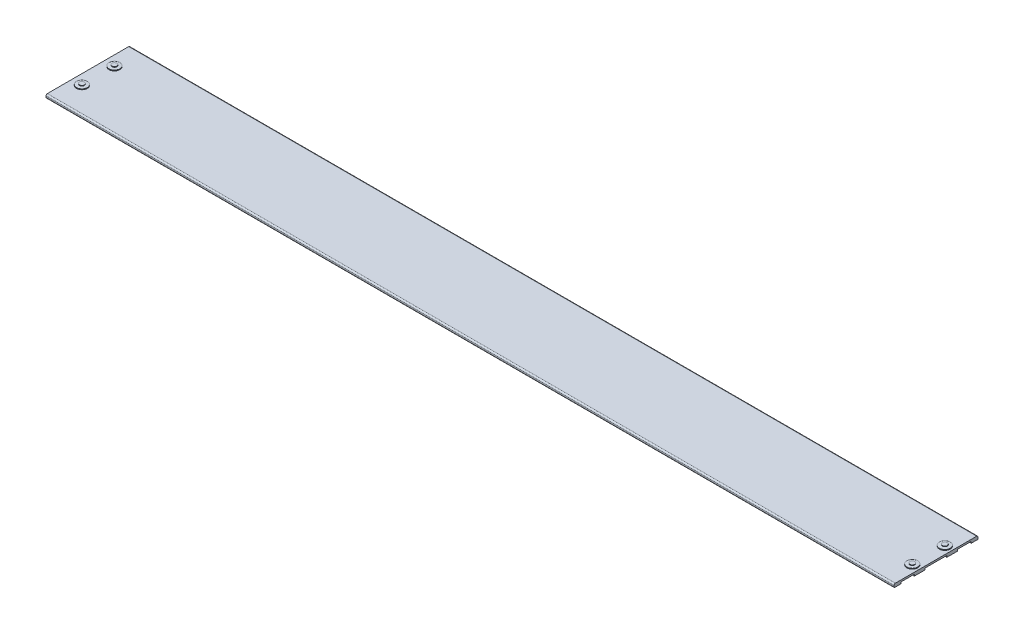
ISO-10303-21;
HEADER;
FILE_DESCRIPTION(('STEP AP214'),'2;1');
FILE_NAME('part.step','',(''),(''),'','','');
FILE_SCHEMA(('AUTOMOTIVE_DESIGN { 1 0 10303 214 1 1 1 1 }'));
ENDSEC;
DATA;
#1=APPLICATION_CONTEXT('core data for automotive mechanical design processes');
#2=APPLICATION_PROTOCOL_DEFINITION('international standard','automotive_design',2000,#1);
#3=PRODUCT_CONTEXT('',#1,'mechanical');
#4=PRODUCT('Part','Part','',(#3));
#5=PRODUCT_RELATED_PRODUCT_CATEGORY('part','',(#4));
#6=PRODUCT_DEFINITION_FORMATION('','',#4);
#7=PRODUCT_DEFINITION_CONTEXT('part definition',#1,'design');
#8=PRODUCT_DEFINITION('design','',#6,#7);
#9=PRODUCT_DEFINITION_SHAPE('','',#8);
#10=(LENGTH_UNIT() NAMED_UNIT(*) SI_UNIT(.MILLI.,.METRE.));
#11=(NAMED_UNIT(*) PLANE_ANGLE_UNIT() SI_UNIT($,.RADIAN.));
#12=(NAMED_UNIT(*) SI_UNIT($,.STERADIAN.) SOLID_ANGLE_UNIT());
#13=UNCERTAINTY_MEASURE_WITH_UNIT(LENGTH_MEASURE(1.E-05),#10,'distance_accuracy_value','');
#14=(GEOMETRIC_REPRESENTATION_CONTEXT(3) GLOBAL_UNCERTAINTY_ASSIGNED_CONTEXT((#13)) GLOBAL_UNIT_ASSIGNED_CONTEXT((#10,
#11,#12)) REPRESENTATION_CONTEXT('',''));
#15=CARTESIAN_POINT('',(0.,0.,0.));
#16=DIRECTION('',(0.,0.,1.));
#17=DIRECTION('',(1.,0.,0.));
#18=AXIS2_PLACEMENT_3D('',#15,#16,#17);
#19=CARTESIAN_POINT('',(-7.5,25.2,-11.1));
#20=DIRECTION('',(0.,1.,0.));
#21=DIRECTION('',(0.,0.,1.));
#22=AXIS2_PLACEMENT_3D('',#19,#20,#21);
#23=PLANE('',#22);
#24=CARTESIAN_POINT('',(-7.5,25.2,-12.));
#25=DIRECTION('',(0.,1.,0.));
#26=DIRECTION('',(0.,0.,1.));
#27=AXIS2_PLACEMENT_3D('',#24,#25,#26);
#28=CIRCLE('',#27,1.8);
#29=CARTESIAN_POINT('',(-7.5,25.2,-10.2));
#30=VERTEX_POINT('',#29);
#31=EDGE_CURVE('E19',#30,#30,#28,.F.);
#32=ORIENTED_EDGE('',*,*,#31,.F.);
#33=EDGE_LOOP('',(#32));
#34=FACE_BOUND('',#33,.T.);
#35=ADVANCED_FACE('F16',(#34),#23,.T.);
#36=CARTESIAN_POINT('',(605.5,25.2,-11.1));
#37=DIRECTION('',(0.,1.,0.));
#38=DIRECTION('',(0.,0.,1.));
#39=AXIS2_PLACEMENT_3D('',#36,#37,#38);
#40=PLANE('',#39);
#41=CARTESIAN_POINT('',(605.5,25.2,-12.));
#42=DIRECTION('',(0.,1.,0.));
#43=DIRECTION('',(0.,0.,1.));
#44=AXIS2_PLACEMENT_3D('',#41,#42,#43);
#45=CIRCLE('',#44,1.8);
#46=CARTESIAN_POINT('',(605.5,25.2,-10.2));
#47=VERTEX_POINT('',#46);
#48=EDGE_CURVE('E376',#47,#47,#45,.F.);
#49=ORIENTED_EDGE('',*,*,#48,.F.);
#50=EDGE_LOOP('',(#49));
#51=FACE_BOUND('',#50,.T.);
#52=ADVANCED_FACE('F386',(#51),#40,.T.);
#53=CARTESIAN_POINT('',(605.5,25.2,12.9));
#54=DIRECTION('',(0.,1.,0.));
#55=DIRECTION('',(0.,0.,1.));
#56=AXIS2_PLACEMENT_3D('',#53,#54,#55);
#57=PLANE('',#56);
#58=CARTESIAN_POINT('',(605.5,25.2,12.));
#59=DIRECTION('',(0.,1.,0.));
#60=DIRECTION('',(0.,0.,1.));
#61=AXIS2_PLACEMENT_3D('',#58,#59,#60);
#62=CIRCLE('',#61,1.8);
#63=CARTESIAN_POINT('',(605.5,25.2,13.8));
#64=VERTEX_POINT('',#63);
#65=EDGE_CURVE('E374',#64,#64,#62,.F.);
#66=ORIENTED_EDGE('',*,*,#65,.F.);
#67=EDGE_LOOP('',(#66));
#68=FACE_BOUND('',#67,.T.);
#69=ADVANCED_FACE('F391',(#68),#57,.T.);
#70=CARTESIAN_POINT('',(-7.5,25.2,12.9));
#71=DIRECTION('',(0.,1.,0.));
#72=DIRECTION('',(0.,0.,1.));
#73=AXIS2_PLACEMENT_3D('',#70,#71,#72);
#74=PLANE('',#73);
#75=CARTESIAN_POINT('',(-7.5,25.2,12.));
#76=DIRECTION('',(0.,1.,0.));
#77=DIRECTION('',(0.,0.,1.));
#78=AXIS2_PLACEMENT_3D('',#75,#76,#77);
#79=CIRCLE('',#78,1.8);
#80=CARTESIAN_POINT('',(-7.5,25.2,13.8));
#81=VERTEX_POINT('',#80);
#82=EDGE_CURVE('E302',#81,#81,#79,.F.);
#83=ORIENTED_EDGE('',*,*,#82,.F.);
#84=EDGE_LOOP('',(#83));
#85=FACE_BOUND('',#84,.T.);
#86=ADVANCED_FACE('F521',(#85),#74,.T.);
#87=CARTESIAN_POINT('',(-7.5,25.,-12.));
#88=DIRECTION('',(0.,1.,0.));
#89=DIRECTION('',(0.,0.,1.));
#90=AXIS2_PLACEMENT_3D('',#87,#88,#89);
#91=CYLINDRICAL_SURFACE('',#90,1.8);
#92=CARTESIAN_POINT('',(-7.5,24.8000000000062,-12.));
#93=DIRECTION('',(0.,-1.,0.));
#94=DIRECTION('',(0.,0.,1.));
#95=AXIS2_PLACEMENT_3D('',#92,#93,#94);
#96=CIRCLE('',#95,1.80000000000246);
#97=CARTESIAN_POINT('',(-7.5,24.8000000000062,-10.1999999999975));
#98=VERTEX_POINT('',#97);
#99=EDGE_CURVE('E313',#98,#98,#96,.T.);
#100=ORIENTED_EDGE('',*,*,#99,.F.);
#101=EDGE_LOOP('',(#100));
#102=FACE_BOUND('',#101,.T.);
#103=ORIENTED_EDGE('',*,*,#31,.T.);
#104=EDGE_LOOP('',(#103));
#105=FACE_BOUND('',#104,.T.);
#106=ADVANCED_FACE('F383',(#102,#105),#91,.T.);
#107=CARTESIAN_POINT('',(605.5,25.,-12.));
#108=DIRECTION('',(0.,1.,0.));
#109=DIRECTION('',(0.,0.,1.));
#110=AXIS2_PLACEMENT_3D('',#107,#108,#109);
#111=CYLINDRICAL_SURFACE('',#110,1.8);
#112=CARTESIAN_POINT('',(605.5,24.8000000000062,-12.));
#113=DIRECTION('',(0.,-1.,0.));
#114=DIRECTION('',(0.,0.,1.));
#115=AXIS2_PLACEMENT_3D('',#112,#113,#114);
#116=CIRCLE('',#115,1.80000000000246);
#117=CARTESIAN_POINT('',(605.5,24.8000000000062,-10.1999999999975));
#118=VERTEX_POINT('',#117);
#119=EDGE_CURVE('E310',#118,#118,#116,.T.);
#120=ORIENTED_EDGE('',*,*,#119,.F.);
#121=EDGE_LOOP('',(#120));
#122=FACE_BOUND('',#121,.T.);
#123=ORIENTED_EDGE('',*,*,#48,.T.);
#124=EDGE_LOOP('',(#123));
#125=FACE_BOUND('',#124,.T.);
#126=ADVANCED_FACE('F514',(#122,#125),#111,.T.);
#127=CARTESIAN_POINT('',(605.5,25.,12.));
#128=DIRECTION('',(0.,1.,0.));
#129=DIRECTION('',(0.,0.,1.));
#130=AXIS2_PLACEMENT_3D('',#127,#128,#129);
#131=CYLINDRICAL_SURFACE('',#130,1.8);
#132=CARTESIAN_POINT('',(605.5,24.799999999999,12.));
#133=DIRECTION('',(0.,-1.,0.));
#134=DIRECTION('',(0.,0.,1.));
#135=AXIS2_PLACEMENT_3D('',#132,#133,#134);
#136=CIRCLE('',#135,1.80000000000336);
#137=CARTESIAN_POINT('',(605.5,24.799999999999,13.8000000000034));
#138=VERTEX_POINT('',#137);
#139=EDGE_CURVE('E307',#138,#138,#136,.T.);
#140=ORIENTED_EDGE('',*,*,#139,.F.);
#141=EDGE_LOOP('',(#140));
#142=FACE_BOUND('',#141,.T.);
#143=ORIENTED_EDGE('',*,*,#65,.T.);
#144=EDGE_LOOP('',(#143));
#145=FACE_BOUND('',#144,.T.);
#146=ADVANCED_FACE('F510',(#142,#145),#131,.T.);
#147=CARTESIAN_POINT('',(-7.5,25.,12.));
#148=DIRECTION('',(0.,1.,0.));
#149=DIRECTION('',(0.,0.,1.));
#150=AXIS2_PLACEMENT_3D('',#147,#148,#149);
#151=CYLINDRICAL_SURFACE('',#150,1.8);
#152=CARTESIAN_POINT('',(-7.5,24.799999999999,12.));
#153=DIRECTION('',(0.,-1.,0.));
#154=DIRECTION('',(0.,0.,1.));
#155=AXIS2_PLACEMENT_3D('',#152,#153,#154);
#156=CIRCLE('',#155,1.80000000000336);
#157=CARTESIAN_POINT('',(-7.5,24.799999999999,13.8000000000034));
#158=VERTEX_POINT('',#157);
#159=EDGE_CURVE('E270',#158,#158,#156,.T.);
#160=ORIENTED_EDGE('',*,*,#159,.F.);
#161=EDGE_LOOP('',(#160));
#162=FACE_BOUND('',#161,.T.);
#163=ORIENTED_EDGE('',*,*,#82,.T.);
#164=EDGE_LOOP('',(#163));
#165=FACE_BOUND('',#164,.T.);
#166=ADVANCED_FACE('F507',(#162,#165),#151,.T.);
#167=CARTESIAN_POINT('',(-15.,22.7,26.));
#168=DIRECTION('',(0.,0.,-1.));
#169=DIRECTION('',(-1.,0.,0.));
#170=AXIS2_PLACEMENT_3D('',#167,#168,#169);
#171=PLANE('',#170);
#172=DIRECTION('',(0.,1.,0.));
#173=VECTOR('',#172,1.);
#174=CARTESIAN_POINT('',(-15.,22.7,26.));
#175=LINE('',#174,#173);
#176=CARTESIAN_POINT('',(-15.,21.5,26.));
#177=VERTEX_POINT('',#176);
#178=CARTESIAN_POINT('',(-15.,22.7,26.));
#179=VERTEX_POINT('',#178);
#180=EDGE_CURVE('E297',#177,#179,#175,.T.);
#181=ORIENTED_EDGE('',*,*,#180,.T.);
#182=DIRECTION('',(1.,0.,0.));
#183=VECTOR('',#182,1.);
#184=CARTESIAN_POINT('',(-15.,22.7,26.));
#185=LINE('',#184,#183);
#186=CARTESIAN_POINT('',(611.,22.7,26.));
#187=VERTEX_POINT('',#186);
#188=EDGE_CURVE('E257',#187,#179,#185,.F.);
#189=ORIENTED_EDGE('',*,*,#188,.F.);
#190=DIRECTION('',(0.,1.,0.));
#191=VECTOR('',#190,1.);
#192=CARTESIAN_POINT('',(611.,22.7,26.));
#193=LINE('',#192,#191);
#194=CARTESIAN_POINT('',(611.,21.5,26.));
#195=VERTEX_POINT('',#194);
#196=EDGE_CURVE('E111',#187,#195,#193,.F.);
#197=ORIENTED_EDGE('',*,*,#196,.T.);
#198=DIRECTION('',(1.,0.,0.));
#199=VECTOR('',#198,1.);
#200=CARTESIAN_POINT('',(-15.,21.5,26.));
#201=LINE('',#200,#199);
#202=EDGE_CURVE('E261',#177,#195,#201,.T.);
#203=ORIENTED_EDGE('',*,*,#202,.F.);
#204=EDGE_LOOP('',(#181,#189,#197,#203));
#205=FACE_BOUND('',#204,.T.);
#206=ADVANCED_FACE('F504',(#205),#171,.T.);
#207=CARTESIAN_POINT('',(-15.,21.5,16.));
#208=DIRECTION('',(0.,0.,1.));
#209=DIRECTION('',(1.,0.,0.));
#210=AXIS2_PLACEMENT_3D('',#207,#208,#209);
#211=PLANE('',#210);
#212=DIRECTION('',(0.,1.,0.));
#213=VECTOR('',#212,1.);
#214=CARTESIAN_POINT('',(-15.,21.5,16.));
#215=LINE('',#214,#213);
#216=CARTESIAN_POINT('',(-15.,22.7,16.));
#217=VERTEX_POINT('',#216);
#218=CARTESIAN_POINT('',(-15.,21.5,16.));
#219=VERTEX_POINT('',#218);
#220=EDGE_CURVE('E193',#217,#219,#215,.F.);
#221=ORIENTED_EDGE('',*,*,#220,.T.);
#222=DIRECTION('',(1.,0.,0.));
#223=VECTOR('',#222,1.);
#224=CARTESIAN_POINT('',(-15.,21.5,16.));
#225=LINE('',#224,#223);
#226=CARTESIAN_POINT('',(611.,21.5,16.));
#227=VERTEX_POINT('',#226);
#228=EDGE_CURVE('E202',#227,#219,#225,.F.);
#229=ORIENTED_EDGE('',*,*,#228,.F.);
#230=DIRECTION('',(0.,1.,0.));
#231=VECTOR('',#230,1.);
#232=CARTESIAN_POINT('',(611.,21.5,16.));
#233=LINE('',#232,#231);
#234=CARTESIAN_POINT('',(611.,22.7,16.));
#235=VERTEX_POINT('',#234);
#236=EDGE_CURVE('E123',#227,#235,#233,.T.);
#237=ORIENTED_EDGE('',*,*,#236,.T.);
#238=DIRECTION('',(1.,0.,0.));
#239=VECTOR('',#238,1.);
#240=CARTESIAN_POINT('',(-15.,22.7,16.));
#241=LINE('',#240,#239);
#242=EDGE_CURVE('E255',#217,#235,#241,.T.);
#243=ORIENTED_EDGE('',*,*,#242,.F.);
#244=EDGE_LOOP('',(#221,#229,#237,#243));
#245=FACE_BOUND('',#244,.T.);
#246=ADVANCED_FACE('F501',(#245),#211,.T.);
#247=CARTESIAN_POINT('',(-15.,22.7,8.));
#248=DIRECTION('',(0.,0.,-1.));
#249=DIRECTION('',(-1.,0.,0.));
#250=AXIS2_PLACEMENT_3D('',#247,#248,#249);
#251=PLANE('',#250);
#252=DIRECTION('',(0.,1.,0.));
#253=VECTOR('',#252,1.);
#254=CARTESIAN_POINT('',(-15.,22.7,8.));
#255=LINE('',#254,#253);
#256=CARTESIAN_POINT('',(-15.,21.5,8.));
#257=VERTEX_POINT('',#256);
#258=CARTESIAN_POINT('',(-15.,22.7,8.));
#259=VERTEX_POINT('',#258);
#260=EDGE_CURVE('E192',#257,#259,#255,.T.);
#261=ORIENTED_EDGE('',*,*,#260,.T.);
#262=DIRECTION('',(1.,0.,0.));
#263=VECTOR('',#262,1.);
#264=CARTESIAN_POINT('',(-15.,22.7,8.));
#265=LINE('',#264,#263);
#266=CARTESIAN_POINT('',(611.,22.7,8.));
#267=VERTEX_POINT('',#266);
#268=EDGE_CURVE('E188',#267,#259,#265,.F.);
#269=ORIENTED_EDGE('',*,*,#268,.F.);
#270=DIRECTION('',(0.,1.,0.));
#271=VECTOR('',#270,1.);
#272=CARTESIAN_POINT('',(611.,22.7,8.));
#273=LINE('',#272,#271);
#274=CARTESIAN_POINT('',(611.,21.5,8.));
#275=VERTEX_POINT('',#274);
#276=EDGE_CURVE('E182',#267,#275,#273,.F.);
#277=ORIENTED_EDGE('',*,*,#276,.T.);
#278=DIRECTION('',(1.,0.,0.));
#279=VECTOR('',#278,1.);
#280=CARTESIAN_POINT('',(-15.,21.5,8.));
#281=LINE('',#280,#279);
#282=EDGE_CURVE('E185',#257,#275,#281,.T.);
#283=ORIENTED_EDGE('',*,*,#282,.F.);
#284=EDGE_LOOP('',(#261,#269,#277,#283));
#285=FACE_BOUND('',#284,.T.);
#286=ADVANCED_FACE('F184',(#285),#251,.T.);
#287=CARTESIAN_POINT('',(-15.,21.5,-8.));
#288=DIRECTION('',(0.,0.,1.));
#289=DIRECTION('',(1.,0.,0.));
#290=AXIS2_PLACEMENT_3D('',#287,#288,#289);
#291=PLANE('',#290);
#292=DIRECTION('',(0.,1.,0.));
#293=VECTOR('',#292,1.);
#294=CARTESIAN_POINT('',(-15.,21.5,-8.));
#295=LINE('',#294,#293);
#296=CARTESIAN_POINT('',(-15.,22.7,-8.));
#297=VERTEX_POINT('',#296);
#298=CARTESIAN_POINT('',(-15.,21.5,-8.));
#299=VERTEX_POINT('',#298);
#300=EDGE_CURVE('E290',#297,#299,#295,.F.);
#301=ORIENTED_EDGE('',*,*,#300,.T.);
#302=DIRECTION('',(1.,0.,0.));
#303=VECTOR('',#302,1.);
#304=CARTESIAN_POINT('',(-15.,21.5,-8.));
#305=LINE('',#304,#303);
#306=CARTESIAN_POINT('',(611.,21.5,-8.));
#307=VERTEX_POINT('',#306);
#308=EDGE_CURVE('E247',#307,#299,#305,.F.);
#309=ORIENTED_EDGE('',*,*,#308,.F.);
#310=DIRECTION('',(0.,1.,0.));
#311=VECTOR('',#310,1.);
#312=CARTESIAN_POINT('',(611.,21.5,-8.));
#313=LINE('',#312,#311);
#314=CARTESIAN_POINT('',(611.,22.7,-8.));
#315=VERTEX_POINT('',#314);
#316=EDGE_CURVE('E292',#307,#315,#313,.T.);
#317=ORIENTED_EDGE('',*,*,#316,.T.);
#318=DIRECTION('',(1.,0.,0.));
#319=VECTOR('',#318,1.);
#320=CARTESIAN_POINT('',(-15.,22.7,-8.));
#321=LINE('',#320,#319);
#322=EDGE_CURVE('E250',#297,#315,#321,.T.);
#323=ORIENTED_EDGE('',*,*,#322,.F.);
#324=EDGE_LOOP('',(#301,#309,#317,#323));
#325=FACE_BOUND('',#324,.T.);
#326=ADVANCED_FACE('F495',(#325),#291,.T.);
#327=CARTESIAN_POINT('',(-15.,22.7,-16.));
#328=DIRECTION('',(0.,0.,-1.));
#329=DIRECTION('',(-1.,0.,0.));
#330=AXIS2_PLACEMENT_3D('',#327,#328,#329);
#331=PLANE('',#330);
#332=DIRECTION('',(0.,1.,0.));
#333=VECTOR('',#332,1.);
#334=CARTESIAN_POINT('',(-15.,22.7,-16.));
#335=LINE('',#334,#333);
#336=CARTESIAN_POINT('',(-15.,21.5,-16.));
#337=VERTEX_POINT('',#336);
#338=CARTESIAN_POINT('',(-15.,22.7,-16.));
#339=VERTEX_POINT('',#338);
#340=EDGE_CURVE('E144',#337,#339,#335,.T.);
#341=ORIENTED_EDGE('',*,*,#340,.T.);
#342=DIRECTION('',(1.,0.,0.));
#343=VECTOR('',#342,1.);
#344=CARTESIAN_POINT('',(-15.,22.7,-16.));
#345=LINE('',#344,#343);
#346=CARTESIAN_POINT('',(611.,22.7,-16.));
#347=VERTEX_POINT('',#346);
#348=EDGE_CURVE('E242',#347,#339,#345,.F.);
#349=ORIENTED_EDGE('',*,*,#348,.F.);
#350=DIRECTION('',(0.,1.,0.));
#351=VECTOR('',#350,1.);
#352=CARTESIAN_POINT('',(611.,22.7,-16.));
#353=LINE('',#352,#351);
#354=CARTESIAN_POINT('',(611.,21.5,-16.));
#355=VERTEX_POINT('',#354);
#356=EDGE_CURVE('E288',#347,#355,#353,.F.);
#357=ORIENTED_EDGE('',*,*,#356,.T.);
#358=DIRECTION('',(1.,0.,0.));
#359=VECTOR('',#358,1.);
#360=CARTESIAN_POINT('',(-15.,21.5,-16.));
#361=LINE('',#360,#359);
#362=EDGE_CURVE('E244',#337,#355,#361,.T.);
#363=ORIENTED_EDGE('',*,*,#362,.F.);
#364=EDGE_LOOP('',(#341,#349,#357,#363));
#365=FACE_BOUND('',#364,.T.);
#366=ADVANCED_FACE('F491',(#365),#331,.T.);
#367=CARTESIAN_POINT('',(-15.,21.5,-26.));
#368=DIRECTION('',(0.,0.,1.));
#369=DIRECTION('',(1.,0.,0.));
#370=AXIS2_PLACEMENT_3D('',#367,#368,#369);
#371=PLANE('',#370);
#372=DIRECTION('',(0.,1.,0.));
#373=VECTOR('',#372,1.);
#374=CARTESIAN_POINT('',(-15.,21.5,-26.));
#375=LINE('',#374,#373);
#376=CARTESIAN_POINT('',(-15.,22.7,-26.));
#377=VERTEX_POINT('',#376);
#378=CARTESIAN_POINT('',(-15.,21.5,-26.));
#379=VERTEX_POINT('',#378);
#380=EDGE_CURVE('E135',#377,#379,#375,.F.);
#381=ORIENTED_EDGE('',*,*,#380,.T.);
#382=DIRECTION('',(1.,0.,0.));
#383=VECTOR('',#382,1.);
#384=CARTESIAN_POINT('',(-15.,21.5,-26.));
#385=LINE('',#384,#383);
#386=CARTESIAN_POINT('',(611.,21.5,-26.));
#387=VERTEX_POINT('',#386);
#388=EDGE_CURVE('E236',#387,#379,#385,.F.);
#389=ORIENTED_EDGE('',*,*,#388,.F.);
#390=DIRECTION('',(0.,1.,0.));
#391=VECTOR('',#390,1.);
#392=CARTESIAN_POINT('',(611.,21.5,-26.));
#393=LINE('',#392,#391);
#394=CARTESIAN_POINT('',(611.,22.7,-26.));
#395=VERTEX_POINT('',#394);
#396=EDGE_CURVE('E95',#387,#395,#393,.T.);
#397=ORIENTED_EDGE('',*,*,#396,.T.);
#398=DIRECTION('',(1.,0.,0.));
#399=VECTOR('',#398,1.);
#400=CARTESIAN_POINT('',(-15.,22.7,-26.));
#401=LINE('',#400,#399);
#402=EDGE_CURVE('E239',#377,#395,#401,.T.);
#403=ORIENTED_EDGE('',*,*,#402,.F.);
#404=EDGE_LOOP('',(#381,#389,#397,#403));
#405=FACE_BOUND('',#404,.T.);
#406=ADVANCED_FACE('F488',(#405),#371,.T.);
#407=CARTESIAN_POINT('',(-15.,22.,-30.5));
#408=DIRECTION('',(-1.,0.,0.));
#409=DIRECTION('',(0.,0.,1.));
#410=AXIS2_PLACEMENT_3D('',#407,#408,#409);
#411=CYLINDRICAL_SURFACE('',#410,0.500000000000001);
#412=CARTESIAN_POINT('',(-15.,22.,-30.5));
#413=DIRECTION('',(-1.,0.,0.));
#414=DIRECTION('',(0.,0.,1.));
#415=AXIS2_PLACEMENT_3D('',#412,#413,#414);
#416=CIRCLE('',#415,0.500000000000001);
#417=CARTESIAN_POINT('',(-15.,21.5,-30.5));
#418=VERTEX_POINT('',#417);
#419=CARTESIAN_POINT('',(-15.,22.,-31.));
#420=VERTEX_POINT('',#419);
#421=EDGE_CURVE('E369',#418,#420,#416,.F.);
#422=ORIENTED_EDGE('',*,*,#421,.T.);
#423=DIRECTION('',(-1.,0.,0.));
#424=VECTOR('',#423,1.);
#425=CARTESIAN_POINT('',(-15.,22.,-31.));
#426=LINE('',#425,#424);
#427=CARTESIAN_POINT('',(611.,22.,-31.));
#428=VERTEX_POINT('',#427);
#429=EDGE_CURVE('E267',#428,#420,#426,.T.);
#430=ORIENTED_EDGE('',*,*,#429,.F.);
#431=CARTESIAN_POINT('',(611.,22.,-30.5));
#432=DIRECTION('',(-1.,0.,0.));
#433=DIRECTION('',(0.,0.,1.));
#434=AXIS2_PLACEMENT_3D('',#431,#432,#433);
#435=CIRCLE('',#434,0.500000000000001);
#436=CARTESIAN_POINT('',(611.,21.5,-30.5));
#437=VERTEX_POINT('',#436);
#438=EDGE_CURVE('E84',#428,#437,#435,.T.);
#439=ORIENTED_EDGE('',*,*,#438,.T.);
#440=DIRECTION('',(1.,0.,0.));
#441=VECTOR('',#440,1.);
#442=CARTESIAN_POINT('',(-15.,21.5,-30.5));
#443=LINE('',#442,#441);
#444=EDGE_CURVE('E229',#418,#437,#443,.T.);
#445=ORIENTED_EDGE('',*,*,#444,.F.);
#446=EDGE_LOOP('',(#422,#430,#439,#445));
#447=FACE_BOUND('',#446,.T.);
#448=ADVANCED_FACE('F484',(#447),#411,.T.);
#449=CARTESIAN_POINT('',(-15.,22.,30.5));
#450=DIRECTION('',(-1.,0.,0.));
#451=DIRECTION('',(0.,0.,1.));
#452=AXIS2_PLACEMENT_3D('',#449,#450,#451);
#453=CYLINDRICAL_SURFACE('',#452,0.5);
#454=CARTESIAN_POINT('',(-15.,22.,30.5));
#455=DIRECTION('',(-1.,0.,0.));
#456=DIRECTION('',(0.,0.,1.));
#457=AXIS2_PLACEMENT_3D('',#454,#455,#456);
#458=CIRCLE('',#457,0.5);
#459=CARTESIAN_POINT('',(-15.,22.,31.));
#460=VERTEX_POINT('',#459);
#461=CARTESIAN_POINT('',(-15.,21.5,30.5));
#462=VERTEX_POINT('',#461);
#463=EDGE_CURVE('E316',#460,#462,#458,.F.);
#464=ORIENTED_EDGE('',*,*,#463,.T.);
#465=DIRECTION('',(1.,0.,0.));
#466=VECTOR('',#465,1.);
#467=CARTESIAN_POINT('',(-15.,21.5,30.5));
#468=LINE('',#467,#466);
#469=CARTESIAN_POINT('',(611.,21.5,30.5));
#470=VERTEX_POINT('',#469);
#471=EDGE_CURVE('E258',#470,#462,#468,.F.);
#472=ORIENTED_EDGE('',*,*,#471,.F.);
#473=CARTESIAN_POINT('',(611.,22.,30.5));
#474=DIRECTION('',(-1.,0.,0.));
#475=DIRECTION('',(0.,0.,1.));
#476=AXIS2_PLACEMENT_3D('',#473,#474,#475);
#477=CIRCLE('',#476,0.5);
#478=CARTESIAN_POINT('',(611.,22.,31.));
#479=VERTEX_POINT('',#478);
#480=EDGE_CURVE('E367',#470,#479,#477,.T.);
#481=ORIENTED_EDGE('',*,*,#480,.T.);
#482=DIRECTION('',(1.,0.,0.));
#483=VECTOR('',#482,1.);
#484=CARTESIAN_POINT('',(-15.,22.,31.));
#485=LINE('',#484,#483);
#486=EDGE_CURVE('E225',#460,#479,#485,.T.);
#487=ORIENTED_EDGE('',*,*,#486,.F.);
#488=EDGE_LOOP('',(#464,#472,#481,#487));
#489=FACE_BOUND('',#488,.T.);
#490=ADVANCED_FACE('F480',(#489),#453,.T.);
#491=CARTESIAN_POINT('',(-7.5,24.6000000000208,-12.));
#492=DIRECTION('',(0.,-1.,0.));
#493=DIRECTION('',(1.,0.,0.));
#494=AXIS2_PLACEMENT_3D('',#491,#492,#493);
#495=CONICAL_SURFACE('',#494,3.99999999984811,1.48013643959503);
#496=CARTESIAN_POINT('',(-7.5,24.6,-12.));
#497=DIRECTION('',(0.,1.,0.));
#498=DIRECTION('',(0.,0.,1.));
#499=AXIS2_PLACEMENT_3D('',#496,#497,#498);
#500=CIRCLE('',#499,4.);
#501=CARTESIAN_POINT('',(-7.5,24.6,-8.));
#502=VERTEX_POINT('',#501);
#503=EDGE_CURVE('E228',#502,#502,#500,.F.);
#504=ORIENTED_EDGE('',*,*,#503,.F.);
#505=EDGE_LOOP('',(#504));
#506=FACE_BOUND('',#505,.T.);
#507=ORIENTED_EDGE('',*,*,#99,.T.);
#508=EDGE_LOOP('',(#507));
#509=FACE_BOUND('',#508,.T.);
#510=ADVANCED_FACE('F476',(#506,#509),#495,.T.);
#511=CARTESIAN_POINT('',(605.5,24.6000000000208,-12.));
#512=DIRECTION('',(0.,-1.,0.));
#513=DIRECTION('',(1.,0.,0.));
#514=AXIS2_PLACEMENT_3D('',#511,#512,#513);
#515=CONICAL_SURFACE('',#514,3.99999999984811,1.48013643959503);
#516=CARTESIAN_POINT('',(605.5,24.6,-12.));
#517=DIRECTION('',(0.,1.,0.));
#518=DIRECTION('',(0.,0.,1.));
#519=AXIS2_PLACEMENT_3D('',#516,#517,#518);
#520=CIRCLE('',#519,4.);
#521=CARTESIAN_POINT('',(605.5,24.6,-8.));
#522=VERTEX_POINT('',#521);
#523=EDGE_CURVE('E276',#522,#522,#520,.F.);
#524=ORIENTED_EDGE('',*,*,#523,.F.);
#525=EDGE_LOOP('',(#524));
#526=FACE_BOUND('',#525,.T.);
#527=ORIENTED_EDGE('',*,*,#119,.T.);
#528=EDGE_LOOP('',(#527));
#529=FACE_BOUND('',#528,.T.);
#530=ADVANCED_FACE('F472',(#526,#529),#515,.T.);
#531=CARTESIAN_POINT('',(605.5,24.6000000000137,12.));
#532=DIRECTION('',(0.,-1.,0.));
#533=DIRECTION('',(0.,0.,-1.));
#534=AXIS2_PLACEMENT_3D('',#531,#532,#533);
#535=CONICAL_SURFACE('',#534,3.99999999990587,1.48013643959735);
#536=CARTESIAN_POINT('',(605.5,24.6,12.));
#537=DIRECTION('',(0.,1.,0.));
#538=DIRECTION('',(0.,0.,1.));
#539=AXIS2_PLACEMENT_3D('',#536,#537,#538);
#540=CIRCLE('',#539,4.);
#541=CARTESIAN_POINT('',(605.5,24.6,16.));
#542=VERTEX_POINT('',#541);
#543=EDGE_CURVE('E273',#542,#542,#540,.F.);
#544=ORIENTED_EDGE('',*,*,#543,.F.);
#545=EDGE_LOOP('',(#544));
#546=FACE_BOUND('',#545,.T.);
#547=ORIENTED_EDGE('',*,*,#139,.T.);
#548=EDGE_LOOP('',(#547));
#549=FACE_BOUND('',#548,.T.);
#550=ADVANCED_FACE('F468',(#546,#549),#535,.T.);
#551=CARTESIAN_POINT('',(-7.5,24.6000000000137,12.));
#552=DIRECTION('',(0.,-1.,0.));
#553=DIRECTION('',(0.,0.,-1.));
#554=AXIS2_PLACEMENT_3D('',#551,#552,#553);
#555=CONICAL_SURFACE('',#554,3.99999999990587,1.48013643959735);
#556=CARTESIAN_POINT('',(-7.5,24.6,12.));
#557=DIRECTION('',(0.,1.,0.));
#558=DIRECTION('',(0.,0.,1.));
#559=AXIS2_PLACEMENT_3D('',#556,#557,#558);
#560=CIRCLE('',#559,4.);
#561=CARTESIAN_POINT('',(-7.5,24.6,16.));
#562=VERTEX_POINT('',#561);
#563=EDGE_CURVE('E220',#562,#562,#560,.F.);
#564=ORIENTED_EDGE('',*,*,#563,.F.);
#565=EDGE_LOOP('',(#564));
#566=FACE_BOUND('',#565,.T.);
#567=ORIENTED_EDGE('',*,*,#159,.T.);
#568=EDGE_LOOP('',(#567));
#569=FACE_BOUND('',#568,.T.);
#570=ADVANCED_FACE('F464',(#566,#569),#555,.T.);
#571=CARTESIAN_POINT('',(-15.,23.,-31.));
#572=DIRECTION('',(0.,0.,-1.));
#573=DIRECTION('',(-1.,0.,0.));
#574=AXIS2_PLACEMENT_3D('',#571,#572,#573);
#575=PLANE('',#574);
#576=DIRECTION('',(0.,1.,0.));
#577=VECTOR('',#576,1.);
#578=CARTESIAN_POINT('',(-15.,23.,-31.));
#579=LINE('',#578,#577);
#580=CARTESIAN_POINT('',(-15.,23.,-31.));
#581=VERTEX_POINT('',#580);
#582=EDGE_CURVE('E262',#420,#581,#579,.T.);
#583=ORIENTED_EDGE('',*,*,#582,.T.);
#584=DIRECTION('',(-1.,0.,0.));
#585=VECTOR('',#584,1.);
#586=CARTESIAN_POINT('',(-15.,23.,-31.));
#587=LINE('',#586,#585);
#588=CARTESIAN_POINT('',(611.,23.,-31.));
#589=VERTEX_POINT('',#588);
#590=EDGE_CURVE('E230',#589,#581,#587,.T.);
#591=ORIENTED_EDGE('',*,*,#590,.F.);
#592=DIRECTION('',(0.,1.,0.));
#593=VECTOR('',#592,1.);
#594=CARTESIAN_POINT('',(611.,21.5,-31.));
#595=LINE('',#594,#593);
#596=EDGE_CURVE('E365',#428,#589,#595,.T.);
#597=ORIENTED_EDGE('',*,*,#596,.F.);
#598=ORIENTED_EDGE('',*,*,#429,.T.);
#599=EDGE_LOOP('',(#583,#591,#597,#598));
#600=FACE_BOUND('',#599,.T.);
#601=ADVANCED_FACE('F460',(#600),#575,.T.);
#602=CARTESIAN_POINT('',(-15.,21.5,26.));
#603=DIRECTION('',(0.,-1.,0.));
#604=DIRECTION('',(0.,0.,-1.));
#605=AXIS2_PLACEMENT_3D('',#602,#603,#604);
#606=PLANE('',#605);
#607=DIRECTION('',(0.,0.,-1.));
#608=VECTOR('',#607,1.);
#609=CARTESIAN_POINT('',(-15.,21.5,0.));
#610=LINE('',#609,#608);
#611=EDGE_CURVE('E233',#462,#177,#610,.T.);
#612=ORIENTED_EDGE('',*,*,#611,.T.);
#613=ORIENTED_EDGE('',*,*,#202,.T.);
#614=DIRECTION('',(0.,0.,-1.));
#615=VECTOR('',#614,1.);
#616=CARTESIAN_POINT('',(611.,21.5,0.));
#617=LINE('',#616,#615);
#618=EDGE_CURVE('E210',#470,#195,#617,.T.);
#619=ORIENTED_EDGE('',*,*,#618,.F.);
#620=ORIENTED_EDGE('',*,*,#471,.T.);
#621=EDGE_LOOP('',(#612,#613,#619,#620));
#622=FACE_BOUND('',#621,.T.);
#623=ADVANCED_FACE('F456',(#622),#606,.T.);
#624=CARTESIAN_POINT('',(-15.,22.7,16.));
#625=DIRECTION('',(0.,-1.,0.));
#626=DIRECTION('',(0.,0.,-1.));
#627=AXIS2_PLACEMENT_3D('',#624,#625,#626);
#628=PLANE('',#627);
#629=DIRECTION('',(0.,0.,-1.));
#630=VECTOR('',#629,1.);
#631=CARTESIAN_POINT('',(-15.,22.7,0.));
#632=LINE('',#631,#630);
#633=EDGE_CURVE('E337',#179,#217,#632,.T.);
#634=ORIENTED_EDGE('',*,*,#633,.T.);
#635=ORIENTED_EDGE('',*,*,#242,.T.);
#636=DIRECTION('',(0.,0.,-1.));
#637=VECTOR('',#636,1.);
#638=CARTESIAN_POINT('',(611.,22.7,0.));
#639=LINE('',#638,#637);
#640=EDGE_CURVE('E206',#187,#235,#639,.T.);
#641=ORIENTED_EDGE('',*,*,#640,.F.);
#642=ORIENTED_EDGE('',*,*,#188,.T.);
#643=EDGE_LOOP('',(#634,#635,#641,#642));
#644=FACE_BOUND('',#643,.T.);
#645=ADVANCED_FACE('F453',(#644),#628,.T.);
#646=CARTESIAN_POINT('',(-15.,21.5,8.));
#647=DIRECTION('',(0.,-1.,0.));
#648=DIRECTION('',(0.,0.,-1.));
#649=AXIS2_PLACEMENT_3D('',#646,#647,#648);
#650=PLANE('',#649);
#651=DIRECTION('',(0.,0.,-1.));
#652=VECTOR('',#651,1.);
#653=CARTESIAN_POINT('',(-15.,21.5,0.));
#654=LINE('',#653,#652);
#655=EDGE_CURVE('E201',#219,#257,#654,.T.);
#656=ORIENTED_EDGE('',*,*,#655,.T.);
#657=ORIENTED_EDGE('',*,*,#282,.T.);
#658=DIRECTION('',(0.,0.,-1.));
#659=VECTOR('',#658,1.);
#660=CARTESIAN_POINT('',(611.,21.5,0.));
#661=LINE('',#660,#659);
#662=EDGE_CURVE('E199',#227,#275,#661,.T.);
#663=ORIENTED_EDGE('',*,*,#662,.F.);
#664=ORIENTED_EDGE('',*,*,#228,.T.);
#665=EDGE_LOOP('',(#656,#657,#663,#664));
#666=FACE_BOUND('',#665,.T.);
#667=ADVANCED_FACE('F197',(#666),#650,.T.);
#668=CARTESIAN_POINT('',(-15.,22.7,-8.));
#669=DIRECTION('',(0.,-1.,0.));
#670=DIRECTION('',(0.,0.,-1.));
#671=AXIS2_PLACEMENT_3D('',#668,#669,#670);
#672=PLANE('',#671);
#673=DIRECTION('',(0.,0.,-1.));
#674=VECTOR('',#673,1.);
#675=CARTESIAN_POINT('',(-15.,22.7,0.));
#676=LINE('',#675,#674);
#677=EDGE_CURVE('E698',#259,#297,#676,.T.);
#678=ORIENTED_EDGE('',*,*,#677,.T.);
#679=ORIENTED_EDGE('',*,*,#322,.T.);
#680=DIRECTION('',(0.,0.,-1.));
#681=VECTOR('',#680,1.);
#682=CARTESIAN_POINT('',(611.,22.7,0.));
#683=LINE('',#682,#681);
#684=EDGE_CURVE('E205',#267,#315,#683,.T.);
#685=ORIENTED_EDGE('',*,*,#684,.F.);
#686=ORIENTED_EDGE('',*,*,#268,.T.);
#687=EDGE_LOOP('',(#678,#679,#685,#686));
#688=FACE_BOUND('',#687,.T.);
#689=ADVANCED_FACE('F446',(#688),#672,.T.);
#690=CARTESIAN_POINT('',(-15.,21.5,-16.));
#691=DIRECTION('',(0.,-1.,0.));
#692=DIRECTION('',(0.,0.,-1.));
#693=AXIS2_PLACEMENT_3D('',#690,#691,#692);
#694=PLANE('',#693);
#695=DIRECTION('',(0.,0.,-1.));
#696=VECTOR('',#695,1.);
#697=CARTESIAN_POINT('',(-15.,21.5,0.));
#698=LINE('',#697,#696);
#699=EDGE_CURVE('E325',#299,#337,#698,.T.);
#700=ORIENTED_EDGE('',*,*,#699,.T.);
#701=ORIENTED_EDGE('',*,*,#362,.T.);
#702=DIRECTION('',(0.,0.,-1.));
#703=VECTOR('',#702,1.);
#704=CARTESIAN_POINT('',(611.,21.5,0.));
#705=LINE('',#704,#703);
#706=EDGE_CURVE('E208',#307,#355,#705,.T.);
#707=ORIENTED_EDGE('',*,*,#706,.F.);
#708=ORIENTED_EDGE('',*,*,#308,.T.);
#709=EDGE_LOOP('',(#700,#701,#707,#708));
#710=FACE_BOUND('',#709,.T.);
#711=ADVANCED_FACE('F442',(#710),#694,.T.);
#712=CARTESIAN_POINT('',(-15.,22.7,-26.));
#713=DIRECTION('',(0.,-1.,0.));
#714=DIRECTION('',(0.,0.,-1.));
#715=AXIS2_PLACEMENT_3D('',#712,#713,#714);
#716=PLANE('',#715);
#717=DIRECTION('',(0.,0.,-1.));
#718=VECTOR('',#717,1.);
#719=CARTESIAN_POINT('',(-15.,22.7,0.));
#720=LINE('',#719,#718);
#721=EDGE_CURVE('E321',#339,#377,#720,.T.);
#722=ORIENTED_EDGE('',*,*,#721,.T.);
#723=ORIENTED_EDGE('',*,*,#402,.T.);
#724=DIRECTION('',(0.,0.,-1.));
#725=VECTOR('',#724,1.);
#726=CARTESIAN_POINT('',(611.,22.7,0.));
#727=LINE('',#726,#725);
#728=EDGE_CURVE('E328',#347,#395,#727,.T.);
#729=ORIENTED_EDGE('',*,*,#728,.F.);
#730=ORIENTED_EDGE('',*,*,#348,.T.);
#731=EDGE_LOOP('',(#722,#723,#729,#730));
#732=FACE_BOUND('',#731,.T.);
#733=ADVANCED_FACE('F438',(#732),#716,.T.);
#734=CARTESIAN_POINT('',(-15.,21.5,-30.5));
#735=DIRECTION('',(0.,-1.,0.));
#736=DIRECTION('',(0.,0.,-1.));
#737=AXIS2_PLACEMENT_3D('',#734,#735,#736);
#738=PLANE('',#737);
#739=DIRECTION('',(0.,0.,-1.));
#740=VECTOR('',#739,1.);
#741=CARTESIAN_POINT('',(-15.,21.5,0.));
#742=LINE('',#741,#740);
#743=EDGE_CURVE('E324',#379,#418,#742,.T.);
#744=ORIENTED_EDGE('',*,*,#743,.T.);
#745=ORIENTED_EDGE('',*,*,#444,.T.);
#746=DIRECTION('',(0.,0.,-1.));
#747=VECTOR('',#746,1.);
#748=CARTESIAN_POINT('',(611.,21.5,0.));
#749=LINE('',#748,#747);
#750=EDGE_CURVE('E330',#387,#437,#749,.T.);
#751=ORIENTED_EDGE('',*,*,#750,.F.);
#752=ORIENTED_EDGE('',*,*,#388,.T.);
#753=EDGE_LOOP('',(#744,#745,#751,#752));
#754=FACE_BOUND('',#753,.T.);
#755=ADVANCED_FACE('F434',(#754),#738,.T.);
#756=CARTESIAN_POINT('',(-15.,22.,31.));
#757=DIRECTION('',(0.,0.,1.));
#758=DIRECTION('',(1.,0.,0.));
#759=AXIS2_PLACEMENT_3D('',#756,#757,#758);
#760=PLANE('',#759);
#761=DIRECTION('',(0.,1.,0.));
#762=VECTOR('',#761,1.);
#763=CARTESIAN_POINT('',(-15.,21.5,31.));
#764=LINE('',#763,#762);
#765=CARTESIAN_POINT('',(-15.,23.,31.));
#766=VERTEX_POINT('',#765);
#767=EDGE_CURVE('E360',#766,#460,#764,.F.);
#768=ORIENTED_EDGE('',*,*,#767,.T.);
#769=ORIENTED_EDGE('',*,*,#486,.T.);
#770=DIRECTION('',(0.,1.,0.));
#771=VECTOR('',#770,1.);
#772=CARTESIAN_POINT('',(611.,21.5,31.));
#773=LINE('',#772,#771);
#774=CARTESIAN_POINT('',(611.,23.,31.));
#775=VERTEX_POINT('',#774);
#776=EDGE_CURVE('E215',#775,#479,#773,.F.);
#777=ORIENTED_EDGE('',*,*,#776,.F.);
#778=DIRECTION('',(-1.,0.,0.));
#779=VECTOR('',#778,1.);
#780=CARTESIAN_POINT('',(-15.,23.,31.));
#781=LINE('',#780,#779);
#782=EDGE_CURVE('E221',#766,#775,#781,.F.);
#783=ORIENTED_EDGE('',*,*,#782,.F.);
#784=EDGE_LOOP('',(#768,#769,#777,#783));
#785=FACE_BOUND('',#784,.T.);
#786=ADVANCED_FACE('F430',(#785),#760,.T.);
#787=CARTESIAN_POINT('',(-7.5,24.3,-12.));
#788=DIRECTION('',(0.,1.,0.));
#789=DIRECTION('',(0.,0.,1.));
#790=AXIS2_PLACEMENT_3D('',#787,#788,#789);
#791=CYLINDRICAL_SURFACE('',#790,4.);
#792=CARTESIAN_POINT('',(-7.5,24.,-12.));
#793=DIRECTION('',(0.,1.,0.));
#794=DIRECTION('',(0.,0.,1.));
#795=AXIS2_PLACEMENT_3D('',#792,#793,#794);
#796=CIRCLE('',#795,4.);
#797=CARTESIAN_POINT('',(-7.5,24.,-8.));
#798=VERTEX_POINT('',#797);
#799=EDGE_CURVE('E224',#798,#798,#796,.F.);
#800=ORIENTED_EDGE('',*,*,#799,.F.);
#801=EDGE_LOOP('',(#800));
#802=FACE_BOUND('',#801,.T.);
#803=ORIENTED_EDGE('',*,*,#503,.T.);
#804=EDGE_LOOP('',(#803));
#805=FACE_BOUND('',#804,.T.);
#806=ADVANCED_FACE('F426',(#802,#805),#791,.T.);
#807=CARTESIAN_POINT('',(605.5,24.3,-12.));
#808=DIRECTION('',(0.,1.,0.));
#809=DIRECTION('',(0.,0.,1.));
#810=AXIS2_PLACEMENT_3D('',#807,#808,#809);
#811=CYLINDRICAL_SURFACE('',#810,4.);
#812=CARTESIAN_POINT('',(605.5,24.,-12.));
#813=DIRECTION('',(0.,1.,0.));
#814=DIRECTION('',(0.,0.,1.));
#815=AXIS2_PLACEMENT_3D('',#812,#813,#814);
#816=CIRCLE('',#815,4.);
#817=CARTESIAN_POINT('',(605.5,24.,-8.));
#818=VERTEX_POINT('',#817);
#819=EDGE_CURVE('E351',#818,#818,#816,.F.);
#820=ORIENTED_EDGE('',*,*,#819,.F.);
#821=EDGE_LOOP('',(#820));
#822=FACE_BOUND('',#821,.T.);
#823=ORIENTED_EDGE('',*,*,#523,.T.);
#824=EDGE_LOOP('',(#823));
#825=FACE_BOUND('',#824,.T.);
#826=ADVANCED_FACE('F422',(#822,#825),#811,.T.);
#827=CARTESIAN_POINT('',(605.5,24.3,12.));
#828=DIRECTION('',(0.,1.,0.));
#829=DIRECTION('',(0.,0.,1.));
#830=AXIS2_PLACEMENT_3D('',#827,#828,#829);
#831=CYLINDRICAL_SURFACE('',#830,4.);
#832=CARTESIAN_POINT('',(605.5,24.,12.));
#833=DIRECTION('',(0.,1.,0.));
#834=DIRECTION('',(0.,0.,1.));
#835=AXIS2_PLACEMENT_3D('',#832,#833,#834);
#836=CIRCLE('',#835,4.);
#837=CARTESIAN_POINT('',(605.5,24.,16.));
#838=VERTEX_POINT('',#837);
#839=EDGE_CURVE('E348',#838,#838,#836,.F.);
#840=ORIENTED_EDGE('',*,*,#839,.F.);
#841=EDGE_LOOP('',(#840));
#842=FACE_BOUND('',#841,.T.);
#843=ORIENTED_EDGE('',*,*,#543,.T.);
#844=EDGE_LOOP('',(#843));
#845=FACE_BOUND('',#844,.T.);
#846=ADVANCED_FACE('F418',(#842,#845),#831,.T.);
#847=CARTESIAN_POINT('',(-7.5,24.3,12.));
#848=DIRECTION('',(0.,1.,0.));
#849=DIRECTION('',(0.,0.,1.));
#850=AXIS2_PLACEMENT_3D('',#847,#848,#849);
#851=CYLINDRICAL_SURFACE('',#850,4.);
#852=CARTESIAN_POINT('',(-7.5,24.,12.));
#853=DIRECTION('',(0.,1.,0.));
#854=DIRECTION('',(0.,0.,1.));
#855=AXIS2_PLACEMENT_3D('',#852,#853,#854);
#856=CIRCLE('',#855,4.);
#857=CARTESIAN_POINT('',(-7.5,24.,16.));
#858=VERTEX_POINT('',#857);
#859=EDGE_CURVE('E344',#858,#858,#856,.F.);
#860=ORIENTED_EDGE('',*,*,#859,.F.);
#861=EDGE_LOOP('',(#860));
#862=FACE_BOUND('',#861,.T.);
#863=ORIENTED_EDGE('',*,*,#563,.T.);
#864=EDGE_LOOP('',(#863));
#865=FACE_BOUND('',#864,.T.);
#866=ADVANCED_FACE('F415',(#862,#865),#851,.T.);
#867=CARTESIAN_POINT('',(611.,21.5,0.));
#868=DIRECTION('',(1.,0.,0.));
#869=DIRECTION('',(0.,0.,-1.));
#870=AXIS2_PLACEMENT_3D('',#867,#868,#869);
#871=PLANE('',#870);
#872=CARTESIAN_POINT('',(611.,23.,-30.));
#873=DIRECTION('',(-1.,0.,0.));
#874=DIRECTION('',(0.,0.,1.));
#875=AXIS2_PLACEMENT_3D('',#872,#873,#874);
#876=CIRCLE('',#875,1.);
#877=CARTESIAN_POINT('',(611.,24.,-30.));
#878=VERTEX_POINT('',#877);
#879=EDGE_CURVE('E234',#878,#589,#876,.T.);
#880=ORIENTED_EDGE('',*,*,#879,.F.);
#881=DIRECTION('',(0.,0.,1.));
#882=VECTOR('',#881,1.);
#883=CARTESIAN_POINT('',(611.,24.,30.));
#884=LINE('',#883,#882);
#885=CARTESIAN_POINT('',(611.,24.,30.));
#886=VERTEX_POINT('',#885);
#887=EDGE_CURVE('E347',#886,#878,#884,.F.);
#888=ORIENTED_EDGE('',*,*,#887,.F.);
#889=CARTESIAN_POINT('',(611.,23.,30.));
#890=DIRECTION('',(-1.,0.,0.));
#891=DIRECTION('',(0.,0.,1.));
#892=AXIS2_PLACEMENT_3D('',#889,#890,#891);
#893=CIRCLE('',#892,1.);
#894=EDGE_CURVE('E357',#775,#886,#893,.T.);
#895=ORIENTED_EDGE('',*,*,#894,.F.);
#896=ORIENTED_EDGE('',*,*,#776,.T.);
#897=ORIENTED_EDGE('',*,*,#480,.F.);
#898=ORIENTED_EDGE('',*,*,#618,.T.);
#899=ORIENTED_EDGE('',*,*,#196,.F.);
#900=ORIENTED_EDGE('',*,*,#640,.T.);
#901=ORIENTED_EDGE('',*,*,#236,.F.);
#902=ORIENTED_EDGE('',*,*,#662,.T.);
#903=ORIENTED_EDGE('',*,*,#276,.F.);
#904=ORIENTED_EDGE('',*,*,#684,.T.);
#905=ORIENTED_EDGE('',*,*,#316,.F.);
#906=ORIENTED_EDGE('',*,*,#706,.T.);
#907=ORIENTED_EDGE('',*,*,#356,.F.);
#908=ORIENTED_EDGE('',*,*,#728,.T.);
#909=ORIENTED_EDGE('',*,*,#396,.F.);
#910=ORIENTED_EDGE('',*,*,#750,.T.);
#911=ORIENTED_EDGE('',*,*,#438,.F.);
#912=ORIENTED_EDGE('',*,*,#596,.T.);
#913=EDGE_LOOP('',(#880,#888,#895,#896,#897,#898,#899,#900,#901,#902,#903,#904,#905,#906,#907,
#908,#909,#910,#911,#912));
#914=FACE_BOUND('',#913,.T.);
#915=ADVANCED_FACE('F204',(#914),#871,.T.);
#916=CARTESIAN_POINT('',(-15.,23.,-30.));
#917=DIRECTION('',(-1.,0.,0.));
#918=DIRECTION('',(0.,0.,1.));
#919=AXIS2_PLACEMENT_3D('',#916,#917,#918);
#920=CYLINDRICAL_SURFACE('',#919,1.);
#921=CARTESIAN_POINT('',(-15.,23.,-30.));
#922=DIRECTION('',(-1.,0.,0.));
#923=DIRECTION('',(0.,0.,1.));
#924=AXIS2_PLACEMENT_3D('',#921,#922,#923);
#925=CIRCLE('',#924,1.);
#926=CARTESIAN_POINT('',(-15.,24.,-30.));
#927=VERTEX_POINT('',#926);
#928=EDGE_CURVE('E361',#581,#927,#925,.F.);
#929=ORIENTED_EDGE('',*,*,#928,.T.);
#930=DIRECTION('',(1.,0.,0.));
#931=VECTOR('',#930,1.);
#932=CARTESIAN_POINT('',(-15.,24.,-30.));
#933=LINE('',#932,#931);
#934=EDGE_CURVE('E707',#878,#927,#933,.F.);
#935=ORIENTED_EDGE('',*,*,#934,.F.);
#936=ORIENTED_EDGE('',*,*,#879,.T.);
#937=ORIENTED_EDGE('',*,*,#590,.T.);
#938=EDGE_LOOP('',(#929,#935,#936,#937));
#939=FACE_BOUND('',#938,.T.);
#940=ADVANCED_FACE('F409',(#939),#920,.T.);
#941=CARTESIAN_POINT('',(-15.,21.5,0.));
#942=DIRECTION('',(1.,0.,0.));
#943=DIRECTION('',(0.,0.,-1.));
#944=AXIS2_PLACEMENT_3D('',#941,#942,#943);
#945=PLANE('',#944);
#946=CARTESIAN_POINT('',(-15.,23.,30.));
#947=DIRECTION('',(-1.,0.,0.));
#948=DIRECTION('',(0.,0.,1.));
#949=AXIS2_PLACEMENT_3D('',#946,#947,#948);
#950=CIRCLE('',#949,1.);
#951=CARTESIAN_POINT('',(-15.,24.,30.));
#952=VERTEX_POINT('',#951);
#953=EDGE_CURVE('E34',#952,#766,#950,.F.);
#954=ORIENTED_EDGE('',*,*,#953,.F.);
#955=DIRECTION('',(0.,0.,1.));
#956=VECTOR('',#955,1.);
#957=CARTESIAN_POINT('',(-15.,24.,30.));
#958=LINE('',#957,#956);
#959=EDGE_CURVE('E25',#927,#952,#958,.T.);
#960=ORIENTED_EDGE('',*,*,#959,.F.);
#961=ORIENTED_EDGE('',*,*,#928,.F.);
#962=ORIENTED_EDGE('',*,*,#582,.F.);
#963=ORIENTED_EDGE('',*,*,#421,.F.);
#964=ORIENTED_EDGE('',*,*,#743,.F.);
#965=ORIENTED_EDGE('',*,*,#380,.F.);
#966=ORIENTED_EDGE('',*,*,#721,.F.);
#967=ORIENTED_EDGE('',*,*,#340,.F.);
#968=ORIENTED_EDGE('',*,*,#699,.F.);
#969=ORIENTED_EDGE('',*,*,#300,.F.);
#970=ORIENTED_EDGE('',*,*,#677,.F.);
#971=ORIENTED_EDGE('',*,*,#260,.F.);
#972=ORIENTED_EDGE('',*,*,#655,.F.);
#973=ORIENTED_EDGE('',*,*,#220,.F.);
#974=ORIENTED_EDGE('',*,*,#633,.F.);
#975=ORIENTED_EDGE('',*,*,#180,.F.);
#976=ORIENTED_EDGE('',*,*,#611,.F.);
#977=ORIENTED_EDGE('',*,*,#463,.F.);
#978=ORIENTED_EDGE('',*,*,#767,.F.);
#979=EDGE_LOOP('',(#954,#960,#961,#962,#963,#964,#965,#966,#967,#968,#969,#970,#971,#972,#973,
#974,#975,#976,#977,#978));
#980=FACE_BOUND('',#979,.T.);
#981=ADVANCED_FACE('F401',(#980),#945,.F.);
#982=CARTESIAN_POINT('',(-15.,23.,30.));
#983=DIRECTION('',(-1.,0.,0.));
#984=DIRECTION('',(0.,0.,1.));
#985=AXIS2_PLACEMENT_3D('',#982,#983,#984);
#986=CYLINDRICAL_SURFACE('',#985,1.);
#987=ORIENTED_EDGE('',*,*,#953,.T.);
#988=ORIENTED_EDGE('',*,*,#782,.T.);
#989=ORIENTED_EDGE('',*,*,#894,.T.);
#990=DIRECTION('',(1.,0.,0.));
#991=VECTOR('',#990,1.);
#992=CARTESIAN_POINT('',(-15.,24.,30.));
#993=LINE('',#992,#991);
#994=EDGE_CURVE('E10',#952,#886,#993,.T.);
#995=ORIENTED_EDGE('',*,*,#994,.F.);
#996=EDGE_LOOP('',(#987,#988,#989,#995));
#997=FACE_BOUND('',#996,.T.);
#998=ADVANCED_FACE('F395',(#997),#986,.T.);
#999=CARTESIAN_POINT('',(-15.,24.,30.));
#1000=DIRECTION('',(0.,1.,0.));
#1001=DIRECTION('',(0.,0.,1.));
#1002=AXIS2_PLACEMENT_3D('',#999,#1000,#1001);
#1003=PLANE('',#1002);
#1004=ORIENTED_EDGE('',*,*,#959,.T.);
#1005=ORIENTED_EDGE('',*,*,#994,.T.);
#1006=ORIENTED_EDGE('',*,*,#887,.T.);
#1007=ORIENTED_EDGE('',*,*,#934,.T.);
#1008=EDGE_LOOP('',(#1004,#1005,#1006,#1007));
#1009=FACE_BOUND('',#1008,.T.);
#1010=ORIENTED_EDGE('',*,*,#859,.T.);
#1011=EDGE_LOOP('',(#1010));
#1012=FACE_BOUND('',#1011,.T.);
#1013=ORIENTED_EDGE('',*,*,#839,.T.);
#1014=EDGE_LOOP('',(#1013));
#1015=FACE_BOUND('',#1014,.T.);
#1016=ORIENTED_EDGE('',*,*,#819,.T.);
#1017=EDGE_LOOP('',(#1016));
#1018=FACE_BOUND('',#1017,.T.);
#1019=ORIENTED_EDGE('',*,*,#799,.T.);
#1020=EDGE_LOOP('',(#1019));
#1021=FACE_BOUND('',#1020,.T.);
#1022=ADVANCED_FACE('F393',(#1009,#1012,#1015,#1018,#1021),#1003,.T.);
#1023=CLOSED_SHELL('',(#35,#52,#69,#86,#106,#126,#146,#166,#206,#246,#286,#326,#366,#406,#448,
#490,#510,#530,#550,#570,#601,#623,#645,#667,#689,#711,#733,#755,#786,#806,#826,#846,#866,#915,
#940,#981,#998,#1022));
#1024=MANIFOLD_SOLID_BREP('B1',#1023);
#1025=ADVANCED_BREP_SHAPE_REPRESENTATION('',(#18,#1024),#14);
#1026=SHAPE_DEFINITION_REPRESENTATION(#9,#1025);
ENDSEC;
END-ISO-10303-21;
